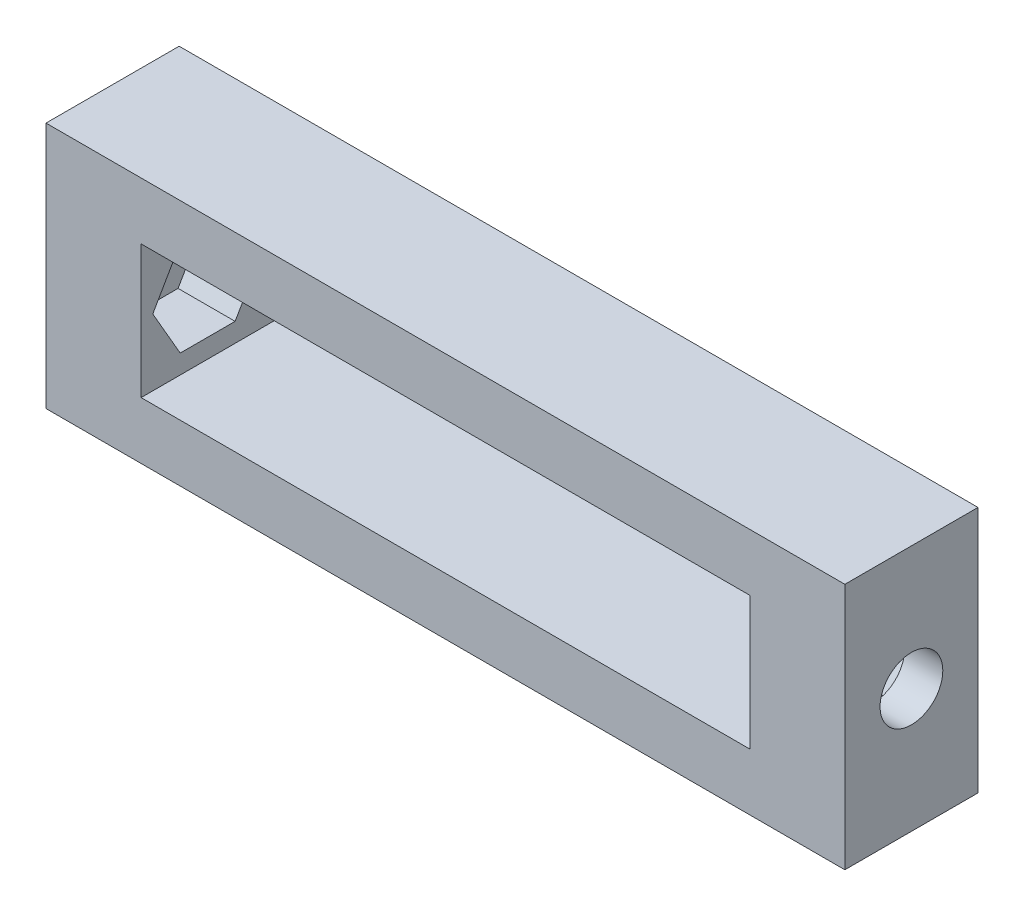
ISO-10303-21;
HEADER;
FILE_DESCRIPTION(('STEP AP214'),'2;1');
FILE_NAME('part.step','',(''),(''),'','','');
FILE_SCHEMA(('AUTOMOTIVE_DESIGN { 1 0 10303 214 1 1 1 1 }'));
ENDSEC;
DATA;
#1=APPLICATION_CONTEXT('core data for automotive mechanical design processes');
#2=APPLICATION_PROTOCOL_DEFINITION('international standard','automotive_design',2000,#1);
#3=PRODUCT_CONTEXT('',#1,'mechanical');
#4=PRODUCT('Part','Part','',(#3));
#5=PRODUCT_RELATED_PRODUCT_CATEGORY('part','',(#4));
#6=PRODUCT_DEFINITION_FORMATION('','',#4);
#7=PRODUCT_DEFINITION_CONTEXT('part definition',#1,'design');
#8=PRODUCT_DEFINITION('design','',#6,#7);
#9=PRODUCT_DEFINITION_SHAPE('','',#8);
#10=(LENGTH_UNIT() NAMED_UNIT(*) SI_UNIT(.MILLI.,.METRE.));
#11=(NAMED_UNIT(*) PLANE_ANGLE_UNIT() SI_UNIT($,.RADIAN.));
#12=(NAMED_UNIT(*) SI_UNIT($,.STERADIAN.) SOLID_ANGLE_UNIT());
#13=UNCERTAINTY_MEASURE_WITH_UNIT(LENGTH_MEASURE(1.E-05),#10,'distance_accuracy_value','');
#14=(GEOMETRIC_REPRESENTATION_CONTEXT(3) GLOBAL_UNCERTAINTY_ASSIGNED_CONTEXT((#13)) GLOBAL_UNIT_ASSIGNED_CONTEXT((#10,
#11,#12)) REPRESENTATION_CONTEXT('',''));
#15=CARTESIAN_POINT('',(0.,0.,0.));
#16=DIRECTION('',(0.,0.,1.));
#17=DIRECTION('',(1.,0.,0.));
#18=AXIS2_PLACEMENT_3D('',#15,#16,#17);
#19=CARTESIAN_POINT('',(16.,7.,-3.5));
#20=DIRECTION('',(-1.,0.,0.));
#21=DIRECTION('',(0.,0.,1.));
#22=AXIS2_PLACEMENT_3D('',#19,#20,#21);
#23=PLANE('',#22);
#24=DIRECTION('',(0.,0.,-1.));
#25=VECTOR('',#24,1.);
#26=CARTESIAN_POINT('',(16.,0.,-3.5));
#27=LINE('',#26,#25);
#28=CARTESIAN_POINT('',(16.,0.,3.5));
#29=VERTEX_POINT('',#28);
#30=CARTESIAN_POINT('',(16.,0.,-3.5));
#31=VERTEX_POINT('',#30);
#32=EDGE_CURVE('E62',#29,#31,#27,.T.);
#33=ORIENTED_EDGE('',*,*,#32,.F.);
#34=DIRECTION('',(0.,-1.,0.));
#35=VECTOR('',#34,1.);
#36=CARTESIAN_POINT('',(16.,7.,3.5));
#37=LINE('',#36,#35);
#38=CARTESIAN_POINT('',(16.,7.,3.5));
#39=VERTEX_POINT('',#38);
#40=EDGE_CURVE('E234',#39,#29,#37,.T.);
#41=ORIENTED_EDGE('',*,*,#40,.F.);
#42=DIRECTION('',(0.,0.,-1.));
#43=VECTOR('',#42,1.);
#44=CARTESIAN_POINT('',(16.,7.,-3.5));
#45=LINE('',#44,#43);
#46=CARTESIAN_POINT('',(16.,7.,-3.5));
#47=VERTEX_POINT('',#46);
#48=EDGE_CURVE('E231',#39,#47,#45,.T.);
#49=ORIENTED_EDGE('',*,*,#48,.T.);
#50=DIRECTION('',(0.,-1.,0.));
#51=VECTOR('',#50,1.);
#52=CARTESIAN_POINT('',(16.,7.,-3.5));
#53=LINE('',#52,#51);
#54=EDGE_CURVE('E238',#47,#31,#53,.T.);
#55=ORIENTED_EDGE('',*,*,#54,.T.);
#56=EDGE_LOOP('',(#33,#41,#49,#55));
#57=FACE_BOUND('',#56,.T.);
#58=DIRECTION('',(0.,-0.866025403784438,0.5));
#59=VECTOR('',#58,1.);
#60=CARTESIAN_POINT('',(16.,6.,1.44337567297406));
#61=LINE('',#60,#59);
#62=CARTESIAN_POINT('',(16.,6.,1.44337567297406));
#63=VERTEX_POINT('',#62);
#64=CARTESIAN_POINT('',(16.,3.5,2.88675134594813));
#65=VERTEX_POINT('',#64);
#66=EDGE_CURVE('E212',#63,#65,#61,.T.);
#67=ORIENTED_EDGE('',*,*,#66,.T.);
#68=DIRECTION('',(0.,-0.866025403784439,-0.5));
#69=VECTOR('',#68,1.);
#70=CARTESIAN_POINT('',(16.,3.5,2.88675134594812));
#71=LINE('',#70,#69);
#72=CARTESIAN_POINT('',(16.,0.999999999999999,1.44337567297406));
#73=VERTEX_POINT('',#72);
#74=EDGE_CURVE('E54',#65,#73,#71,.T.);
#75=ORIENTED_EDGE('',*,*,#74,.T.);
#76=DIRECTION('',(0.,0.,-1.));
#77=VECTOR('',#76,1.);
#78=CARTESIAN_POINT('',(16.,0.999999999999999,1.44337567297406));
#79=LINE('',#78,#77);
#80=CARTESIAN_POINT('',(16.,0.999999999999999,-1.44337567297407));
#81=VERTEX_POINT('',#80);
#82=EDGE_CURVE('E196',#73,#81,#79,.T.);
#83=ORIENTED_EDGE('',*,*,#82,.T.);
#84=DIRECTION('',(0.,0.866025403784439,-0.5));
#85=VECTOR('',#84,1.);
#86=CARTESIAN_POINT('',(16.,0.999999999999999,-1.44337567297407));
#87=LINE('',#86,#85);
#88=CARTESIAN_POINT('',(16.,3.5,-2.88675134594813));
#89=VERTEX_POINT('',#88);
#90=EDGE_CURVE('E199',#81,#89,#87,.T.);
#91=ORIENTED_EDGE('',*,*,#90,.T.);
#92=DIRECTION('',(0.,0.866025403784439,0.5));
#93=VECTOR('',#92,1.);
#94=CARTESIAN_POINT('',(16.,3.5,-2.88675134594813));
#95=LINE('',#94,#93);
#96=CARTESIAN_POINT('',(16.,6.,-1.44337567297407));
#97=VERTEX_POINT('',#96);
#98=EDGE_CURVE('E217',#89,#97,#95,.T.);
#99=ORIENTED_EDGE('',*,*,#98,.T.);
#100=DIRECTION('',(0.,0.,1.));
#101=VECTOR('',#100,1.);
#102=CARTESIAN_POINT('',(16.,6.,-1.44337567297407));
#103=LINE('',#102,#101);
#104=EDGE_CURVE('E214',#97,#63,#103,.T.);
#105=ORIENTED_EDGE('',*,*,#104,.T.);
#106=EDGE_LOOP('',(#67,#75,#83,#91,#99,#105));
#107=FACE_BOUND('',#106,.T.);
#108=ADVANCED_FACE('F39',(#57,#107),#23,.T.);
#109=CARTESIAN_POINT('',(0.,0.,0.));
#110=DIRECTION('',(0.,-1.,0.));
#111=DIRECTION('',(0.,0.,-1.));
#112=AXIS2_PLACEMENT_3D('',#109,#110,#111);
#113=PLANE('',#112);
#114=DIRECTION('',(1.,0.,0.));
#115=VECTOR('',#114,1.);
#116=CARTESIAN_POINT('',(-21.,0.,3.5));
#117=LINE('',#116,#115);
#118=CARTESIAN_POINT('',(-16.,0.,3.5));
#119=VERTEX_POINT('',#118);
#120=EDGE_CURVE('E330',#119,#29,#117,.T.);
#121=ORIENTED_EDGE('',*,*,#120,.T.);
#122=ORIENTED_EDGE('',*,*,#32,.T.);
#123=DIRECTION('',(1.,0.,0.));
#124=VECTOR('',#123,1.);
#125=CARTESIAN_POINT('',(-21.,0.,-3.5));
#126=LINE('',#125,#124);
#127=CARTESIAN_POINT('',(-16.,0.,-3.5));
#128=VERTEX_POINT('',#127);
#129=EDGE_CURVE('E325',#128,#31,#126,.T.);
#130=ORIENTED_EDGE('',*,*,#129,.F.);
#131=DIRECTION('',(0.,0.,-1.));
#132=VECTOR('',#131,1.);
#133=CARTESIAN_POINT('',(-16.,0.,-3.5));
#134=LINE('',#133,#132);
#135=EDGE_CURVE('E303',#119,#128,#134,.T.);
#136=ORIENTED_EDGE('',*,*,#135,.F.);
#137=EDGE_LOOP('',(#121,#122,#130,#136));
#138=FACE_BOUND('',#137,.T.);
#139=ADVANCED_FACE('F378',(#138),#113,.F.);
#140=CARTESIAN_POINT('',(-21.,-3.,3.5));
#141=DIRECTION('',(1.,0.,0.));
#142=DIRECTION('',(0.,0.,-1.));
#143=AXIS2_PLACEMENT_3D('',#140,#141,#142);
#144=PLANE('',#143);
#145=CARTESIAN_POINT('',(-21.,3.5,0.));
#146=DIRECTION('',(1.,0.,0.));
#147=DIRECTION('',(0.,0.,-1.));
#148=AXIS2_PLACEMENT_3D('',#145,#146,#147);
#149=CIRCLE('',#148,1.65);
#150=CARTESIAN_POINT('',(-21.,3.5,-1.65));
#151=VERTEX_POINT('',#150);
#152=EDGE_CURVE('E262',#151,#151,#149,.F.);
#153=ORIENTED_EDGE('',*,*,#152,.F.);
#154=EDGE_LOOP('',(#153));
#155=FACE_BOUND('',#154,.T.);
#156=DIRECTION('',(0.,1.,0.));
#157=VECTOR('',#156,1.);
#158=CARTESIAN_POINT('',(-21.,-3.,3.5));
#159=LINE('',#158,#157);
#160=CARTESIAN_POINT('',(-21.,-3.,3.5));
#161=VERTEX_POINT('',#160);
#162=CARTESIAN_POINT('',(-21.,10.,3.5));
#163=VERTEX_POINT('',#162);
#164=EDGE_CURVE('E338',#161,#163,#159,.T.);
#165=ORIENTED_EDGE('',*,*,#164,.T.);
#166=DIRECTION('',(0.,0.,-1.));
#167=VECTOR('',#166,1.);
#168=CARTESIAN_POINT('',(-21.,10.,3.5));
#169=LINE('',#168,#167);
#170=CARTESIAN_POINT('',(-21.,10.,-3.5));
#171=VERTEX_POINT('',#170);
#172=EDGE_CURVE('E242',#163,#171,#169,.T.);
#173=ORIENTED_EDGE('',*,*,#172,.T.);
#174=DIRECTION('',(0.,1.,0.));
#175=VECTOR('',#174,1.);
#176=CARTESIAN_POINT('',(-21.,-3.,-3.5));
#177=LINE('',#176,#175);
#178=CARTESIAN_POINT('',(-21.,-3.,-3.5));
#179=VERTEX_POINT('',#178);
#180=EDGE_CURVE('E11',#179,#171,#177,.T.);
#181=ORIENTED_EDGE('',*,*,#180,.F.);
#182=DIRECTION('',(0.,0.,-1.));
#183=VECTOR('',#182,1.);
#184=CARTESIAN_POINT('',(-21.,-3.,3.5));
#185=LINE('',#184,#183);
#186=EDGE_CURVE('E326',#161,#179,#185,.T.);
#187=ORIENTED_EDGE('',*,*,#186,.F.);
#188=EDGE_LOOP('',(#165,#173,#181,#187));
#189=FACE_BOUND('',#188,.T.);
#190=ADVANCED_FACE('F41',(#155,#189),#144,.F.);
#191=CARTESIAN_POINT('',(-21.,-3.,-3.5));
#192=DIRECTION('',(0.,0.,1.));
#193=DIRECTION('',(1.,0.,0.));
#194=AXIS2_PLACEMENT_3D('',#191,#192,#193);
#195=PLANE('',#194);
#196=DIRECTION('',(1.,0.,0.));
#197=VECTOR('',#196,1.);
#198=CARTESIAN_POINT('',(-21.,10.,-3.5));
#199=LINE('',#198,#197);
#200=CARTESIAN_POINT('',(21.,10.,-3.5));
#201=VERTEX_POINT('',#200);
#202=EDGE_CURVE('E252',#171,#201,#199,.T.);
#203=ORIENTED_EDGE('',*,*,#202,.T.);
#204=DIRECTION('',(0.,1.,0.));
#205=VECTOR('',#204,1.);
#206=CARTESIAN_POINT('',(21.,-3.,-3.5));
#207=LINE('',#206,#205);
#208=CARTESIAN_POINT('',(21.,-3.,-3.5));
#209=VERTEX_POINT('',#208);
#210=EDGE_CURVE('E47',#209,#201,#207,.T.);
#211=ORIENTED_EDGE('',*,*,#210,.F.);
#212=DIRECTION('',(1.,0.,0.));
#213=VECTOR('',#212,1.);
#214=CARTESIAN_POINT('',(-21.,-3.,-3.5));
#215=LINE('',#214,#213);
#216=EDGE_CURVE('E329',#179,#209,#215,.T.);
#217=ORIENTED_EDGE('',*,*,#216,.F.);
#218=ORIENTED_EDGE('',*,*,#180,.T.);
#219=EDGE_LOOP('',(#203,#211,#217,#218));
#220=FACE_BOUND('',#219,.T.);
#221=ORIENTED_EDGE('',*,*,#129,.T.);
#222=ORIENTED_EDGE('',*,*,#54,.F.);
#223=DIRECTION('',(1.,0.,0.));
#224=VECTOR('',#223,1.);
#225=CARTESIAN_POINT('',(-21.,7.,-3.5));
#226=LINE('',#225,#224);
#227=CARTESIAN_POINT('',(-16.,7.,-3.5));
#228=VERTEX_POINT('',#227);
#229=EDGE_CURVE('E246',#228,#47,#226,.T.);
#230=ORIENTED_EDGE('',*,*,#229,.F.);
#231=DIRECTION('',(0.,-1.,0.));
#232=VECTOR('',#231,1.);
#233=CARTESIAN_POINT('',(-16.,7.,-3.5));
#234=LINE('',#233,#232);
#235=EDGE_CURVE('E317',#228,#128,#234,.T.);
#236=ORIENTED_EDGE('',*,*,#235,.T.);
#237=EDGE_LOOP('',(#221,#222,#230,#236));
#238=FACE_BOUND('',#237,.T.);
#239=ADVANCED_FACE('F354',(#220,#238),#195,.F.);
#240=CARTESIAN_POINT('',(21.,-3.,3.5));
#241=DIRECTION('',(1.,0.,0.));
#242=DIRECTION('',(0.,0.,-1.));
#243=AXIS2_PLACEMENT_3D('',#240,#241,#242);
#244=PLANE('',#243);
#245=CARTESIAN_POINT('',(21.,3.5,0.));
#246=DIRECTION('',(1.,0.,0.));
#247=DIRECTION('',(0.,0.,-1.));
#248=AXIS2_PLACEMENT_3D('',#245,#246,#247);
#249=CIRCLE('',#248,1.65);
#250=CARTESIAN_POINT('',(21.,3.5,-1.65));
#251=VERTEX_POINT('',#250);
#252=EDGE_CURVE('E202',#251,#251,#249,.T.);
#253=ORIENTED_EDGE('',*,*,#252,.F.);
#254=EDGE_LOOP('',(#253));
#255=FACE_BOUND('',#254,.T.);
#256=ORIENTED_EDGE('',*,*,#210,.T.);
#257=DIRECTION('',(0.,0.,-1.));
#258=VECTOR('',#257,1.);
#259=CARTESIAN_POINT('',(21.,10.,3.5));
#260=LINE('',#259,#258);
#261=CARTESIAN_POINT('',(21.,10.,3.5));
#262=VERTEX_POINT('',#261);
#263=EDGE_CURVE('E249',#262,#201,#260,.T.);
#264=ORIENTED_EDGE('',*,*,#263,.F.);
#265=DIRECTION('',(0.,1.,0.));
#266=VECTOR('',#265,1.);
#267=CARTESIAN_POINT('',(21.,-3.,3.5));
#268=LINE('',#267,#266);
#269=CARTESIAN_POINT('',(21.,-3.,3.5));
#270=VERTEX_POINT('',#269);
#271=EDGE_CURVE('E342',#270,#262,#268,.T.);
#272=ORIENTED_EDGE('',*,*,#271,.F.);
#273=DIRECTION('',(0.,0.,-1.));
#274=VECTOR('',#273,1.);
#275=CARTESIAN_POINT('',(21.,-3.,3.5));
#276=LINE('',#275,#274);
#277=EDGE_CURVE('E332',#270,#209,#276,.T.);
#278=ORIENTED_EDGE('',*,*,#277,.T.);
#279=EDGE_LOOP('',(#256,#264,#272,#278));
#280=FACE_BOUND('',#279,.T.);
#281=ADVANCED_FACE('F346',(#255,#280),#244,.T.);
#282=CARTESIAN_POINT('',(-21.,-3.,3.5));
#283=DIRECTION('',(0.,0.,1.));
#284=DIRECTION('',(1.,0.,0.));
#285=AXIS2_PLACEMENT_3D('',#282,#283,#284);
#286=PLANE('',#285);
#287=ORIENTED_EDGE('',*,*,#40,.T.);
#288=ORIENTED_EDGE('',*,*,#120,.F.);
#289=DIRECTION('',(0.,-1.,0.));
#290=VECTOR('',#289,1.);
#291=CARTESIAN_POINT('',(-16.,7.,3.5));
#292=LINE('',#291,#290);
#293=CARTESIAN_POINT('',(-16.,7.,3.5));
#294=VERTEX_POINT('',#293);
#295=EDGE_CURVE('E322',#294,#119,#292,.T.);
#296=ORIENTED_EDGE('',*,*,#295,.F.);
#297=DIRECTION('',(1.,0.,0.));
#298=VECTOR('',#297,1.);
#299=CARTESIAN_POINT('',(-21.,7.,3.5));
#300=LINE('',#299,#298);
#301=EDGE_CURVE('E241',#294,#39,#300,.T.);
#302=ORIENTED_EDGE('',*,*,#301,.T.);
#303=EDGE_LOOP('',(#287,#288,#296,#302));
#304=FACE_BOUND('',#303,.T.);
#305=ORIENTED_EDGE('',*,*,#271,.T.);
#306=DIRECTION('',(1.,0.,0.));
#307=VECTOR('',#306,1.);
#308=CARTESIAN_POINT('',(-21.,10.,3.5));
#309=LINE('',#308,#307);
#310=EDGE_CURVE('E245',#163,#262,#309,.T.);
#311=ORIENTED_EDGE('',*,*,#310,.F.);
#312=ORIENTED_EDGE('',*,*,#164,.F.);
#313=DIRECTION('',(1.,0.,0.));
#314=VECTOR('',#313,1.);
#315=CARTESIAN_POINT('',(-21.,-3.,3.5));
#316=LINE('',#315,#314);
#317=EDGE_CURVE('E335',#161,#270,#316,.T.);
#318=ORIENTED_EDGE('',*,*,#317,.T.);
#319=EDGE_LOOP('',(#305,#311,#312,#318));
#320=FACE_BOUND('',#319,.T.);
#321=ADVANCED_FACE('F361',(#304,#320),#286,.T.);
#322=CARTESIAN_POINT('',(0.,-3.,0.));
#323=DIRECTION('',(0.,-1.,0.));
#324=DIRECTION('',(0.,0.,-1.));
#325=AXIS2_PLACEMENT_3D('',#322,#323,#324);
#326=PLANE('',#325);
#327=ORIENTED_EDGE('',*,*,#186,.T.);
#328=ORIENTED_EDGE('',*,*,#216,.T.);
#329=ORIENTED_EDGE('',*,*,#277,.F.);
#330=ORIENTED_EDGE('',*,*,#317,.F.);
#331=EDGE_LOOP('',(#327,#328,#329,#330));
#332=FACE_BOUND('',#331,.T.);
#333=ADVANCED_FACE('F363',(#332),#326,.T.);
#334=CARTESIAN_POINT('',(-16.,7.,-3.5));
#335=DIRECTION('',(-1.,0.,0.));
#336=DIRECTION('',(0.,0.,1.));
#337=AXIS2_PLACEMENT_3D('',#334,#335,#336);
#338=PLANE('',#337);
#339=DIRECTION('',(0.,0.,-1.));
#340=VECTOR('',#339,1.);
#341=CARTESIAN_POINT('',(-16.,0.999999999999999,1.44337567297406));
#342=LINE('',#341,#340);
#343=CARTESIAN_POINT('',(-16.,0.999999999999999,1.44337567297406));
#344=VERTEX_POINT('',#343);
#345=CARTESIAN_POINT('',(-16.,0.999999999999999,-1.44337567297407));
#346=VERTEX_POINT('',#345);
#347=EDGE_CURVE('E287',#344,#346,#342,.T.);
#348=ORIENTED_EDGE('',*,*,#347,.F.);
#349=DIRECTION('',(0.,-0.866025403784439,-0.5));
#350=VECTOR('',#349,1.);
#351=CARTESIAN_POINT('',(-16.,3.5,2.88675134594812));
#352=LINE('',#351,#350);
#353=CARTESIAN_POINT('',(-16.,3.5,2.88675134594812));
#354=VERTEX_POINT('',#353);
#355=EDGE_CURVE('E265',#354,#344,#352,.T.);
#356=ORIENTED_EDGE('',*,*,#355,.F.);
#357=DIRECTION('',(0.,-0.866025403784438,0.5));
#358=VECTOR('',#357,1.);
#359=CARTESIAN_POINT('',(-16.,6.,1.44337567297406));
#360=LINE('',#359,#358);
#361=CARTESIAN_POINT('',(-16.,6.,1.44337567297406));
#362=VERTEX_POINT('',#361);
#363=EDGE_CURVE('E270',#362,#354,#360,.T.);
#364=ORIENTED_EDGE('',*,*,#363,.F.);
#365=DIRECTION('',(0.,0.,1.));
#366=VECTOR('',#365,1.);
#367=CARTESIAN_POINT('',(-16.,6.,-1.44337567297407));
#368=LINE('',#367,#366);
#369=CARTESIAN_POINT('',(-16.,6.,-1.44337567297407));
#370=VERTEX_POINT('',#369);
#371=EDGE_CURVE('E296',#370,#362,#368,.T.);
#372=ORIENTED_EDGE('',*,*,#371,.F.);
#373=DIRECTION('',(0.,0.866025403784439,0.5));
#374=VECTOR('',#373,1.);
#375=CARTESIAN_POINT('',(-16.,3.5,-2.88675134594813));
#376=LINE('',#375,#374);
#377=CARTESIAN_POINT('',(-16.,3.5,-2.88675134594813));
#378=VERTEX_POINT('',#377);
#379=EDGE_CURVE('E293',#378,#370,#376,.T.);
#380=ORIENTED_EDGE('',*,*,#379,.F.);
#381=DIRECTION('',(0.,0.866025403784439,-0.5));
#382=VECTOR('',#381,1.);
#383=CARTESIAN_POINT('',(-16.,0.999999999999999,-1.44337567297407));
#384=LINE('',#383,#382);
#385=EDGE_CURVE('E290',#346,#378,#384,.T.);
#386=ORIENTED_EDGE('',*,*,#385,.F.);
#387=EDGE_LOOP('',(#348,#356,#364,#372,#380,#386));
#388=FACE_BOUND('',#387,.T.);
#389=ORIENTED_EDGE('',*,*,#135,.T.);
#390=ORIENTED_EDGE('',*,*,#235,.F.);
#391=DIRECTION('',(0.,0.,-1.));
#392=VECTOR('',#391,1.);
#393=CARTESIAN_POINT('',(-16.,7.,-3.5));
#394=LINE('',#393,#392);
#395=EDGE_CURVE('E314',#294,#228,#394,.T.);
#396=ORIENTED_EDGE('',*,*,#395,.F.);
#397=ORIENTED_EDGE('',*,*,#295,.T.);
#398=EDGE_LOOP('',(#389,#390,#396,#397));
#399=FACE_BOUND('',#398,.T.);
#400=ADVANCED_FACE('F365',(#388,#399),#338,.F.);
#401=CARTESIAN_POINT('',(-19.,3.5,2.88675134594812));
#402=DIRECTION('',(0.,-0.5,0.866025403784439));
#403=DIRECTION('',(0.,-0.866025403784439,-0.5));
#404=AXIS2_PLACEMENT_3D('',#401,#402,#403);
#405=PLANE('',#404);
#406=ORIENTED_EDGE('',*,*,#355,.T.);
#407=DIRECTION('',(1.,0.,0.));
#408=VECTOR('',#407,1.);
#409=CARTESIAN_POINT('',(-19.,0.999999999999999,1.44337567297406));
#410=LINE('',#409,#408);
#411=CARTESIAN_POINT('',(-19.,0.999999999999999,1.44337567297406));
#412=VERTEX_POINT('',#411);
#413=EDGE_CURVE('E285',#412,#344,#410,.T.);
#414=ORIENTED_EDGE('',*,*,#413,.F.);
#415=DIRECTION('',(0.,-0.866025403784439,-0.5));
#416=VECTOR('',#415,1.);
#417=CARTESIAN_POINT('',(-19.,3.5,2.88675134594812));
#418=LINE('',#417,#416);
#419=CARTESIAN_POINT('',(-19.,3.5,2.88675134594812));
#420=VERTEX_POINT('',#419);
#421=EDGE_CURVE('E266',#420,#412,#418,.T.);
#422=ORIENTED_EDGE('',*,*,#421,.F.);
#423=DIRECTION('',(1.,0.,0.));
#424=VECTOR('',#423,1.);
#425=CARTESIAN_POINT('',(-19.,3.5,2.88675134594812));
#426=LINE('',#425,#424);
#427=EDGE_CURVE('E301',#420,#354,#426,.T.);
#428=ORIENTED_EDGE('',*,*,#427,.T.);
#429=EDGE_LOOP('',(#406,#414,#422,#428));
#430=FACE_BOUND('',#429,.T.);
#431=ADVANCED_FACE('F371',(#430),#405,.F.);
#432=CARTESIAN_POINT('',(-19.,6.,1.44337567297406));
#433=DIRECTION('',(0.,0.5,0.866025403784439));
#434=DIRECTION('',(0.,-0.866025403784439,0.5));
#435=AXIS2_PLACEMENT_3D('',#432,#433,#434);
#436=PLANE('',#435);
#437=ORIENTED_EDGE('',*,*,#363,.T.);
#438=ORIENTED_EDGE('',*,*,#427,.F.);
#439=DIRECTION('',(0.,-0.866025403784438,0.5));
#440=VECTOR('',#439,1.);
#441=CARTESIAN_POINT('',(-19.,6.,1.44337567297406));
#442=LINE('',#441,#440);
#443=CARTESIAN_POINT('',(-19.,6.,1.44337567297406));
#444=VERTEX_POINT('',#443);
#445=EDGE_CURVE('E282',#444,#420,#442,.T.);
#446=ORIENTED_EDGE('',*,*,#445,.F.);
#447=DIRECTION('',(1.,0.,0.));
#448=VECTOR('',#447,1.);
#449=CARTESIAN_POINT('',(-19.,6.,1.44337567297406));
#450=LINE('',#449,#448);
#451=EDGE_CURVE('E304',#444,#362,#450,.T.);
#452=ORIENTED_EDGE('',*,*,#451,.T.);
#453=EDGE_LOOP('',(#437,#438,#446,#452));
#454=FACE_BOUND('',#453,.T.);
#455=ADVANCED_FACE('F403',(#454),#436,.F.);
#456=CARTESIAN_POINT('',(-19.,6.,-1.44337567297407));
#457=DIRECTION('',(0.,1.,0.));
#458=DIRECTION('',(0.,0.,1.));
#459=AXIS2_PLACEMENT_3D('',#456,#457,#458);
#460=PLANE('',#459);
#461=ORIENTED_EDGE('',*,*,#371,.T.);
#462=ORIENTED_EDGE('',*,*,#451,.F.);
#463=DIRECTION('',(0.,0.,1.));
#464=VECTOR('',#463,1.);
#465=CARTESIAN_POINT('',(-19.,6.,-1.44337567297407));
#466=LINE('',#465,#464);
#467=CARTESIAN_POINT('',(-19.,6.,-1.44337567297407));
#468=VERTEX_POINT('',#467);
#469=EDGE_CURVE('E279',#468,#444,#466,.T.);
#470=ORIENTED_EDGE('',*,*,#469,.F.);
#471=DIRECTION('',(1.,0.,0.));
#472=VECTOR('',#471,1.);
#473=CARTESIAN_POINT('',(-19.,6.,-1.44337567297407));
#474=LINE('',#473,#472);
#475=EDGE_CURVE('E306',#468,#370,#474,.T.);
#476=ORIENTED_EDGE('',*,*,#475,.T.);
#477=EDGE_LOOP('',(#461,#462,#470,#476));
#478=FACE_BOUND('',#477,.T.);
#479=ADVANCED_FACE('F406',(#478),#460,.F.);
#480=CARTESIAN_POINT('',(-19.,3.5,-2.88675134594813));
#481=DIRECTION('',(0.,0.5,-0.866025403784439));
#482=DIRECTION('',(0.,0.866025403784439,0.5));
#483=AXIS2_PLACEMENT_3D('',#480,#481,#482);
#484=PLANE('',#483);
#485=ORIENTED_EDGE('',*,*,#379,.T.);
#486=ORIENTED_EDGE('',*,*,#475,.F.);
#487=DIRECTION('',(0.,0.866025403784439,0.5));
#488=VECTOR('',#487,1.);
#489=CARTESIAN_POINT('',(-19.,3.5,-2.88675134594813));
#490=LINE('',#489,#488);
#491=CARTESIAN_POINT('',(-19.,3.5,-2.88675134594813));
#492=VERTEX_POINT('',#491);
#493=EDGE_CURVE('E276',#492,#468,#490,.T.);
#494=ORIENTED_EDGE('',*,*,#493,.F.);
#495=DIRECTION('',(1.,0.,0.));
#496=VECTOR('',#495,1.);
#497=CARTESIAN_POINT('',(-19.,3.5,-2.88675134594813));
#498=LINE('',#497,#496);
#499=EDGE_CURVE('E308',#492,#378,#498,.T.);
#500=ORIENTED_EDGE('',*,*,#499,.T.);
#501=EDGE_LOOP('',(#485,#486,#494,#500));
#502=FACE_BOUND('',#501,.T.);
#503=ADVANCED_FACE('F410',(#502),#484,.F.);
#504=CARTESIAN_POINT('',(-19.,0.999999999999999,-1.44337567297407));
#505=DIRECTION('',(0.,-0.5,-0.866025403784439));
#506=DIRECTION('',(0.,0.866025403784439,-0.5));
#507=AXIS2_PLACEMENT_3D('',#504,#505,#506);
#508=PLANE('',#507);
#509=ORIENTED_EDGE('',*,*,#385,.T.);
#510=ORIENTED_EDGE('',*,*,#499,.F.);
#511=DIRECTION('',(0.,0.866025403784439,-0.5));
#512=VECTOR('',#511,1.);
#513=CARTESIAN_POINT('',(-19.,0.999999999999999,-1.44337567297407));
#514=LINE('',#513,#512);
#515=CARTESIAN_POINT('',(-19.,0.999999999999999,-1.44337567297407));
#516=VERTEX_POINT('',#515);
#517=EDGE_CURVE('E273',#516,#492,#514,.T.);
#518=ORIENTED_EDGE('',*,*,#517,.F.);
#519=DIRECTION('',(1.,0.,0.));
#520=VECTOR('',#519,1.);
#521=CARTESIAN_POINT('',(-19.,0.999999999999999,-1.44337567297407));
#522=LINE('',#521,#520);
#523=EDGE_CURVE('E310',#516,#346,#522,.T.);
#524=ORIENTED_EDGE('',*,*,#523,.T.);
#525=EDGE_LOOP('',(#509,#510,#518,#524));
#526=FACE_BOUND('',#525,.T.);
#527=ADVANCED_FACE('F414',(#526),#508,.F.);
#528=CARTESIAN_POINT('',(-19.,0.999999999999999,1.44337567297406));
#529=DIRECTION('',(0.,-1.,0.));
#530=DIRECTION('',(0.,0.,-1.));
#531=AXIS2_PLACEMENT_3D('',#528,#529,#530);
#532=PLANE('',#531);
#533=ORIENTED_EDGE('',*,*,#347,.T.);
#534=ORIENTED_EDGE('',*,*,#523,.F.);
#535=DIRECTION('',(0.,0.,-1.));
#536=VECTOR('',#535,1.);
#537=CARTESIAN_POINT('',(-19.,0.999999999999999,1.44337567297406));
#538=LINE('',#537,#536);
#539=EDGE_CURVE('E269',#412,#516,#538,.T.);
#540=ORIENTED_EDGE('',*,*,#539,.F.);
#541=ORIENTED_EDGE('',*,*,#413,.T.);
#542=EDGE_LOOP('',(#533,#534,#540,#541));
#543=FACE_BOUND('',#542,.T.);
#544=ADVANCED_FACE('F401',(#543),#532,.F.);
#545=CARTESIAN_POINT('',(-19.,0.,0.));
#546=DIRECTION('',(1.,0.,0.));
#547=DIRECTION('',(0.,0.,-1.));
#548=AXIS2_PLACEMENT_3D('',#545,#546,#547);
#549=PLANE('',#548);
#550=CARTESIAN_POINT('',(-19.,3.5,0.));
#551=DIRECTION('',(1.,0.,0.));
#552=DIRECTION('',(0.,0.,-1.));
#553=AXIS2_PLACEMENT_3D('',#550,#551,#552);
#554=CIRCLE('',#553,1.65);
#555=CARTESIAN_POINT('',(-19.,3.5,-1.65));
#556=VERTEX_POINT('',#555);
#557=EDGE_CURVE('E255',#556,#556,#554,.T.);
#558=ORIENTED_EDGE('',*,*,#557,.F.);
#559=EDGE_LOOP('',(#558));
#560=FACE_BOUND('',#559,.T.);
#561=ORIENTED_EDGE('',*,*,#421,.T.);
#562=ORIENTED_EDGE('',*,*,#539,.T.);
#563=ORIENTED_EDGE('',*,*,#517,.T.);
#564=ORIENTED_EDGE('',*,*,#493,.T.);
#565=ORIENTED_EDGE('',*,*,#469,.T.);
#566=ORIENTED_EDGE('',*,*,#445,.T.);
#567=EDGE_LOOP('',(#561,#562,#563,#564,#565,#566));
#568=FACE_BOUND('',#567,.T.);
#569=ADVANCED_FACE('F397',(#560,#568),#549,.T.);
#570=CARTESIAN_POINT('',(-21.001,3.5,0.));
#571=DIRECTION('',(1.,0.,0.));
#572=DIRECTION('',(0.,0.,-1.));
#573=AXIS2_PLACEMENT_3D('',#570,#571,#572);
#574=CYLINDRICAL_SURFACE('',#573,1.65);
#575=ORIENTED_EDGE('',*,*,#557,.T.);
#576=EDGE_LOOP('',(#575));
#577=FACE_BOUND('',#576,.T.);
#578=ORIENTED_EDGE('',*,*,#152,.T.);
#579=EDGE_LOOP('',(#578));
#580=FACE_BOUND('',#579,.T.);
#581=ADVANCED_FACE('F393',(#577,#580),#574,.F.);
#582=CARTESIAN_POINT('',(0.,7.,0.));
#583=DIRECTION('',(0.,1.,0.));
#584=DIRECTION('',(0.,0.,-1.));
#585=AXIS2_PLACEMENT_3D('',#582,#583,#584);
#586=PLANE('',#585);
#587=ORIENTED_EDGE('',*,*,#229,.T.);
#588=ORIENTED_EDGE('',*,*,#48,.F.);
#589=ORIENTED_EDGE('',*,*,#301,.F.);
#590=ORIENTED_EDGE('',*,*,#395,.T.);
#591=EDGE_LOOP('',(#587,#588,#589,#590));
#592=FACE_BOUND('',#591,.T.);
#593=ADVANCED_FACE('F390',(#592),#586,.F.);
#594=CARTESIAN_POINT('',(0.,10.,0.));
#595=DIRECTION('',(0.,1.,0.));
#596=DIRECTION('',(0.,0.,-1.));
#597=AXIS2_PLACEMENT_3D('',#594,#595,#596);
#598=PLANE('',#597);
#599=ORIENTED_EDGE('',*,*,#172,.F.);
#600=ORIENTED_EDGE('',*,*,#310,.T.);
#601=ORIENTED_EDGE('',*,*,#263,.T.);
#602=ORIENTED_EDGE('',*,*,#202,.F.);
#603=EDGE_LOOP('',(#599,#600,#601,#602));
#604=FACE_BOUND('',#603,.T.);
#605=ADVANCED_FACE('F352',(#604),#598,.T.);
#606=CARTESIAN_POINT('',(19.,3.5,2.88675134594812));
#607=DIRECTION('',(0.,0.5,-0.866025403784439));
#608=DIRECTION('',(0.,0.866025403784439,0.5));
#609=AXIS2_PLACEMENT_3D('',#606,#607,#608);
#610=PLANE('',#609);
#611=ORIENTED_EDGE('',*,*,#74,.F.);
#612=DIRECTION('',(-1.,0.,0.));
#613=VECTOR('',#612,1.);
#614=CARTESIAN_POINT('',(19.,3.5,2.88675134594812));
#615=LINE('',#614,#613);
#616=CARTESIAN_POINT('',(19.,3.5,2.88675134594812));
#617=VERTEX_POINT('',#616);
#618=EDGE_CURVE('E180',#617,#65,#615,.T.);
#619=ORIENTED_EDGE('',*,*,#618,.F.);
#620=DIRECTION('',(0.,-0.866025403784439,-0.5));
#621=VECTOR('',#620,1.);
#622=CARTESIAN_POINT('',(19.,3.5,2.88675134594812));
#623=LINE('',#622,#621);
#624=CARTESIAN_POINT('',(19.,0.999999999999999,1.44337567297406));
#625=VERTEX_POINT('',#624);
#626=EDGE_CURVE('E187',#617,#625,#623,.T.);
#627=ORIENTED_EDGE('',*,*,#626,.T.);
#628=DIRECTION('',(-1.,0.,0.));
#629=VECTOR('',#628,1.);
#630=CARTESIAN_POINT('',(19.,0.999999999999999,1.44337567297406));
#631=LINE('',#630,#629);
#632=EDGE_CURVE('E222',#625,#73,#631,.T.);
#633=ORIENTED_EDGE('',*,*,#632,.T.);
#634=EDGE_LOOP('',(#611,#619,#627,#633));
#635=FACE_BOUND('',#634,.T.);
#636=ADVANCED_FACE('F190',(#635),#610,.T.);
#637=CARTESIAN_POINT('',(19.,0.999999999999999,1.44337567297406));
#638=DIRECTION('',(0.,1.,0.));
#639=DIRECTION('',(0.,0.,1.));
#640=AXIS2_PLACEMENT_3D('',#637,#638,#639);
#641=PLANE('',#640);
#642=ORIENTED_EDGE('',*,*,#82,.F.);
#643=ORIENTED_EDGE('',*,*,#632,.F.);
#644=DIRECTION('',(0.,0.,-1.));
#645=VECTOR('',#644,1.);
#646=CARTESIAN_POINT('',(19.,0.999999999999999,1.44337567297406));
#647=LINE('',#646,#645);
#648=CARTESIAN_POINT('',(19.,0.999999999999999,-1.44337567297407));
#649=VERTEX_POINT('',#648);
#650=EDGE_CURVE('E192',#625,#649,#647,.T.);
#651=ORIENTED_EDGE('',*,*,#650,.T.);
#652=DIRECTION('',(-1.,0.,0.));
#653=VECTOR('',#652,1.);
#654=CARTESIAN_POINT('',(19.,0.999999999999999,-1.44337567297407));
#655=LINE('',#654,#653);
#656=EDGE_CURVE('E224',#649,#81,#655,.T.);
#657=ORIENTED_EDGE('',*,*,#656,.T.);
#658=EDGE_LOOP('',(#642,#643,#651,#657));
#659=FACE_BOUND('',#658,.T.);
#660=ADVANCED_FACE('F505',(#659),#641,.T.);
#661=CARTESIAN_POINT('',(19.,0.999999999999999,-1.44337567297407));
#662=DIRECTION('',(0.,0.5,0.866025403784439));
#663=DIRECTION('',(0.,-0.866025403784439,0.5));
#664=AXIS2_PLACEMENT_3D('',#661,#662,#663);
#665=PLANE('',#664);
#666=ORIENTED_EDGE('',*,*,#90,.F.);
#667=ORIENTED_EDGE('',*,*,#656,.F.);
#668=DIRECTION('',(0.,0.866025403784439,-0.5));
#669=VECTOR('',#668,1.);
#670=CARTESIAN_POINT('',(19.,0.999999999999999,-1.44337567297407));
#671=LINE('',#670,#669);
#672=CARTESIAN_POINT('',(19.,3.5,-2.88675134594813));
#673=VERTEX_POINT('',#672);
#674=EDGE_CURVE('E208',#649,#673,#671,.T.);
#675=ORIENTED_EDGE('',*,*,#674,.T.);
#676=DIRECTION('',(-1.,0.,0.));
#677=VECTOR('',#676,1.);
#678=CARTESIAN_POINT('',(19.,3.5,-2.88675134594813));
#679=LINE('',#678,#677);
#680=EDGE_CURVE('E226',#673,#89,#679,.T.);
#681=ORIENTED_EDGE('',*,*,#680,.T.);
#682=EDGE_LOOP('',(#666,#667,#675,#681));
#683=FACE_BOUND('',#682,.T.);
#684=ADVANCED_FACE('F514',(#683),#665,.T.);
#685=CARTESIAN_POINT('',(19.,3.5,-2.88675134594813));
#686=DIRECTION('',(0.,-0.5,0.866025403784439));
#687=DIRECTION('',(0.,-0.866025403784439,-0.5));
#688=AXIS2_PLACEMENT_3D('',#685,#686,#687);
#689=PLANE('',#688);
#690=ORIENTED_EDGE('',*,*,#98,.F.);
#691=ORIENTED_EDGE('',*,*,#680,.F.);
#692=DIRECTION('',(0.,0.866025403784439,0.5));
#693=VECTOR('',#692,1.);
#694=CARTESIAN_POINT('',(19.,3.5,-2.88675134594813));
#695=LINE('',#694,#693);
#696=CARTESIAN_POINT('',(19.,6.,-1.44337567297407));
#697=VERTEX_POINT('',#696);
#698=EDGE_CURVE('E206',#673,#697,#695,.T.);
#699=ORIENTED_EDGE('',*,*,#698,.T.);
#700=DIRECTION('',(-1.,0.,0.));
#701=VECTOR('',#700,1.);
#702=CARTESIAN_POINT('',(19.,6.,-1.44337567297407));
#703=LINE('',#702,#701);
#704=EDGE_CURVE('E228',#697,#97,#703,.T.);
#705=ORIENTED_EDGE('',*,*,#704,.T.);
#706=EDGE_LOOP('',(#690,#691,#699,#705));
#707=FACE_BOUND('',#706,.T.);
#708=ADVANCED_FACE('F525',(#707),#689,.T.);
#709=CARTESIAN_POINT('',(19.,6.,-1.44337567297407));
#710=DIRECTION('',(0.,-1.,0.));
#711=DIRECTION('',(0.,0.,-1.));
#712=AXIS2_PLACEMENT_3D('',#709,#710,#711);
#713=PLANE('',#712);
#714=ORIENTED_EDGE('',*,*,#104,.F.);
#715=ORIENTED_EDGE('',*,*,#704,.F.);
#716=DIRECTION('',(0.,0.,1.));
#717=VECTOR('',#716,1.);
#718=CARTESIAN_POINT('',(19.,6.,-1.44337567297407));
#719=LINE('',#718,#717);
#720=CARTESIAN_POINT('',(19.,6.,1.44337567297406));
#721=VERTEX_POINT('',#720);
#722=EDGE_CURVE('E186',#697,#721,#719,.T.);
#723=ORIENTED_EDGE('',*,*,#722,.T.);
#724=DIRECTION('',(-1.,0.,0.));
#725=VECTOR('',#724,1.);
#726=CARTESIAN_POINT('',(19.,6.,1.44337567297406));
#727=LINE('',#726,#725);
#728=EDGE_CURVE('E182',#721,#63,#727,.T.);
#729=ORIENTED_EDGE('',*,*,#728,.T.);
#730=EDGE_LOOP('',(#714,#715,#723,#729));
#731=FACE_BOUND('',#730,.T.);
#732=ADVANCED_FACE('F536',(#731),#713,.T.);
#733=CARTESIAN_POINT('',(19.,6.,1.44337567297406));
#734=DIRECTION('',(0.,-0.5,-0.866025403784439));
#735=DIRECTION('',(0.,0.866025403784439,-0.5));
#736=AXIS2_PLACEMENT_3D('',#733,#734,#735);
#737=PLANE('',#736);
#738=ORIENTED_EDGE('',*,*,#66,.F.);
#739=ORIENTED_EDGE('',*,*,#728,.F.);
#740=DIRECTION('',(0.,-0.866025403784438,0.5));
#741=VECTOR('',#740,1.);
#742=CARTESIAN_POINT('',(19.,6.,1.44337567297406));
#743=LINE('',#742,#741);
#744=EDGE_CURVE('E177',#721,#617,#743,.T.);
#745=ORIENTED_EDGE('',*,*,#744,.T.);
#746=ORIENTED_EDGE('',*,*,#618,.T.);
#747=EDGE_LOOP('',(#738,#739,#745,#746));
#748=FACE_BOUND('',#747,.T.);
#749=ADVANCED_FACE('F179',(#748),#737,.T.);
#750=CARTESIAN_POINT('',(19.,0.,0.));
#751=DIRECTION('',(-1.,0.,0.));
#752=DIRECTION('',(0.,0.,-1.));
#753=AXIS2_PLACEMENT_3D('',#750,#751,#752);
#754=PLANE('',#753);
#755=CARTESIAN_POINT('',(19.,3.5,0.));
#756=DIRECTION('',(1.,0.,0.));
#757=DIRECTION('',(0.,0.,-1.));
#758=AXIS2_PLACEMENT_3D('',#755,#756,#757);
#759=CIRCLE('',#758,1.65);
#760=CARTESIAN_POINT('',(19.,3.5,-1.65));
#761=VERTEX_POINT('',#760);
#762=EDGE_CURVE('E715',#761,#761,#759,.T.);
#763=ORIENTED_EDGE('',*,*,#762,.T.);
#764=EDGE_LOOP('',(#763));
#765=FACE_BOUND('',#764,.T.);
#766=ORIENTED_EDGE('',*,*,#626,.F.);
#767=ORIENTED_EDGE('',*,*,#744,.F.);
#768=ORIENTED_EDGE('',*,*,#722,.F.);
#769=ORIENTED_EDGE('',*,*,#698,.F.);
#770=ORIENTED_EDGE('',*,*,#674,.F.);
#771=ORIENTED_EDGE('',*,*,#650,.F.);
#772=EDGE_LOOP('',(#766,#767,#768,#769,#770,#771));
#773=FACE_BOUND('',#772,.T.);
#774=ADVANCED_FACE('F194',(#765,#773),#754,.T.);
#775=CARTESIAN_POINT('',(21.001,3.5,0.));
#776=DIRECTION('',(-1.,0.,0.));
#777=DIRECTION('',(0.,0.,1.));
#778=AXIS2_PLACEMENT_3D('',#775,#776,#777);
#779=CYLINDRICAL_SURFACE('',#778,1.65);
#780=ORIENTED_EDGE('',*,*,#252,.T.);
#781=EDGE_LOOP('',(#780));
#782=FACE_BOUND('',#781,.T.);
#783=ORIENTED_EDGE('',*,*,#762,.F.);
#784=EDGE_LOOP('',(#783));
#785=FACE_BOUND('',#784,.T.);
#786=ADVANCED_FACE('F565',(#782,#785),#779,.F.);
#787=CLOSED_SHELL('',(#108,#139,#190,#239,#281,#321,#333,#400,#431,#455,#479,#503,#527,#544,
#569,#581,#593,#605,#636,#660,#684,#708,#732,#749,#774,#786));
#788=MANIFOLD_SOLID_BREP('B2',#787);
#789=ADVANCED_BREP_SHAPE_REPRESENTATION('',(#18,#788),#14);
#790=SHAPE_DEFINITION_REPRESENTATION(#9,#789);
ENDSEC;
END-ISO-10303-21;
